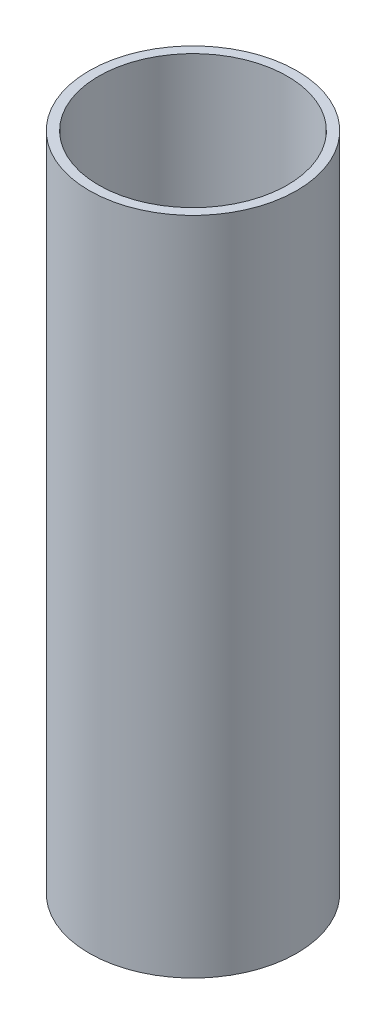
ISO-10303-21;
HEADER;
FILE_DESCRIPTION(('STEP AP214'),'2;1');
FILE_NAME('part.step','',(''),(''),'','','');
FILE_SCHEMA(('AUTOMOTIVE_DESIGN { 1 0 10303 214 1 1 1 1 }'));
ENDSEC;
DATA;
#1=APPLICATION_CONTEXT('core data for automotive mechanical design processes');
#2=APPLICATION_PROTOCOL_DEFINITION('international standard','automotive_design',2000,#1);
#3=PRODUCT_CONTEXT('',#1,'mechanical');
#4=PRODUCT('Part','Part','',(#3));
#5=PRODUCT_RELATED_PRODUCT_CATEGORY('part','',(#4));
#6=PRODUCT_DEFINITION_FORMATION('','',#4);
#7=PRODUCT_DEFINITION_CONTEXT('part definition',#1,'design');
#8=PRODUCT_DEFINITION('design','',#6,#7);
#9=PRODUCT_DEFINITION_SHAPE('','',#8);
#10=(LENGTH_UNIT() NAMED_UNIT(*) SI_UNIT(.MILLI.,.METRE.));
#11=(NAMED_UNIT(*) PLANE_ANGLE_UNIT() SI_UNIT($,.RADIAN.));
#12=(NAMED_UNIT(*) SI_UNIT($,.STERADIAN.) SOLID_ANGLE_UNIT());
#13=UNCERTAINTY_MEASURE_WITH_UNIT(LENGTH_MEASURE(1.E-05),#10,'distance_accuracy_value','');
#14=(GEOMETRIC_REPRESENTATION_CONTEXT(3) GLOBAL_UNCERTAINTY_ASSIGNED_CONTEXT((#13)) GLOBAL_UNIT_ASSIGNED_CONTEXT((#10,
#11,#12)) REPRESENTATION_CONTEXT('',''));
#15=CARTESIAN_POINT('',(0.,0.,0.));
#16=DIRECTION('',(0.,0.,1.));
#17=DIRECTION('',(1.,0.,0.));
#18=AXIS2_PLACEMENT_3D('',#15,#16,#17);
#19=CARTESIAN_POINT('',(0.,350.,0.));
#20=DIRECTION('',(0.,-1.,0.));
#21=DIRECTION('',(0.,0.,-1.));
#22=AXIS2_PLACEMENT_3D('',#19,#20,#21);
#23=CYLINDRICAL_SURFACE('',#22,55.);
#24=CARTESIAN_POINT('',(0.,350.,0.));
#25=DIRECTION('',(0.,1.,0.));
#26=DIRECTION('',(0.,0.,1.));
#27=AXIS2_PLACEMENT_3D('',#24,#25,#26);
#28=CIRCLE('',#27,55.);
#29=CARTESIAN_POINT('',(0.,350.,55.));
#30=VERTEX_POINT('',#29);
#31=EDGE_CURVE('E10',#30,#30,#28,.T.);
#32=ORIENTED_EDGE('',*,*,#31,.F.);
#33=EDGE_LOOP('',(#32));
#34=FACE_BOUND('',#33,.T.);
#35=CARTESIAN_POINT('',(0.,0.,0.));
#36=DIRECTION('',(0.,1.,0.));
#37=DIRECTION('',(0.,0.,1.));
#38=AXIS2_PLACEMENT_3D('',#35,#36,#37);
#39=CIRCLE('',#38,55.);
#40=CARTESIAN_POINT('',(0.,0.,55.));
#41=VERTEX_POINT('',#40);
#42=EDGE_CURVE('E35',#41,#41,#39,.T.);
#43=ORIENTED_EDGE('',*,*,#42,.T.);
#44=EDGE_LOOP('',(#43));
#45=FACE_BOUND('',#44,.T.);
#46=ADVANCED_FACE('F32',(#34,#45),#23,.T.);
#47=CARTESIAN_POINT('',(0.,350.,0.));
#48=DIRECTION('',(0.,1.,0.));
#49=DIRECTION('',(0.,0.,1.));
#50=AXIS2_PLACEMENT_3D('',#47,#48,#49);
#51=PLANE('',#50);
#52=CARTESIAN_POINT('',(0.,350.,0.));
#53=DIRECTION('',(0.,1.,0.));
#54=DIRECTION('',(0.,0.,1.));
#55=AXIS2_PLACEMENT_3D('',#52,#53,#54);
#56=CIRCLE('',#55,50.);
#57=CARTESIAN_POINT('',(0.,350.,50.));
#58=VERTEX_POINT('',#57);
#59=EDGE_CURVE('E46',#58,#58,#56,.T.);
#60=ORIENTED_EDGE('',*,*,#59,.F.);
#61=EDGE_LOOP('',(#60));
#62=FACE_BOUND('',#61,.T.);
#63=ORIENTED_EDGE('',*,*,#31,.T.);
#64=EDGE_LOOP('',(#63));
#65=FACE_BOUND('',#64,.T.);
#66=ADVANCED_FACE('F52',(#62,#65),#51,.T.);
#67=CARTESIAN_POINT('',(0.,0.,0.));
#68=DIRECTION('',(0.,1.,0.));
#69=DIRECTION('',(0.,0.,1.));
#70=AXIS2_PLACEMENT_3D('',#67,#68,#69);
#71=PLANE('',#70);
#72=CARTESIAN_POINT('',(0.,0.,0.));
#73=DIRECTION('',(0.,1.,0.));
#74=DIRECTION('',(0.,0.,1.));
#75=AXIS2_PLACEMENT_3D('',#72,#73,#74);
#76=CIRCLE('',#75,50.);
#77=CARTESIAN_POINT('',(0.,0.,50.));
#78=VERTEX_POINT('',#77);
#79=EDGE_CURVE('E42',#78,#78,#76,.F.);
#80=ORIENTED_EDGE('',*,*,#79,.F.);
#81=EDGE_LOOP('',(#80));
#82=FACE_BOUND('',#81,.T.);
#83=ORIENTED_EDGE('',*,*,#42,.F.);
#84=EDGE_LOOP('',(#83));
#85=FACE_BOUND('',#84,.T.);
#86=ADVANCED_FACE('F54',(#82,#85),#71,.F.);
#87=CARTESIAN_POINT('',(0.,-141.42135623731,0.));
#88=DIRECTION('',(0.,1.,0.));
#89=DIRECTION('',(0.,0.,1.));
#90=AXIS2_PLACEMENT_3D('',#87,#88,#89);
#91=CYLINDRICAL_SURFACE('',#90,50.);
#92=CARTESIAN_POINT('',(0.,0.,50.));
#93=CARTESIAN_POINT('',(0.,3.64583333333331,50.));
#94=CARTESIAN_POINT('',(0.,7.29166666666665,50.));
#95=CARTESIAN_POINT('',(0.,14.5833333333333,50.));
#96=CARTESIAN_POINT('',(0.,18.2291666666667,50.));
#97=CARTESIAN_POINT('',(0.,25.5208333333333,50.));
#98=CARTESIAN_POINT('',(0.,29.1666666666667,50.));
#99=CARTESIAN_POINT('',(0.,36.4583333333333,50.));
#100=CARTESIAN_POINT('',(0.,40.1041666666667,50.));
#101=CARTESIAN_POINT('',(0.,47.3958333333333,50.));
#102=CARTESIAN_POINT('',(0.,51.0416666666667,50.));
#103=CARTESIAN_POINT('',(0.,58.3333333333333,50.));
#104=CARTESIAN_POINT('',(0.,61.9791666666667,50.));
#105=CARTESIAN_POINT('',(0.,69.2708333333334,50.));
#106=CARTESIAN_POINT('',(0.,72.9166666666667,50.));
#107=CARTESIAN_POINT('',(0.,80.2083333333333,50.));
#108=CARTESIAN_POINT('',(0.,83.8541666666667,50.));
#109=CARTESIAN_POINT('',(0.,91.1458333333334,50.));
#110=CARTESIAN_POINT('',(0.,94.7916666666667,50.));
#111=CARTESIAN_POINT('',(0.,102.083333333333,50.));
#112=CARTESIAN_POINT('',(0.,105.729166666667,50.));
#113=CARTESIAN_POINT('',(0.,113.020833333333,50.));
#114=CARTESIAN_POINT('',(0.,116.666666666667,50.));
#115=CARTESIAN_POINT('',(0.,123.958333333333,50.));
#116=CARTESIAN_POINT('',(0.,127.604166666667,50.));
#117=CARTESIAN_POINT('',(0.,134.895833333333,50.));
#118=CARTESIAN_POINT('',(0.,138.541666666667,50.));
#119=CARTESIAN_POINT('',(0.,145.833333333333,50.));
#120=CARTESIAN_POINT('',(0.,149.479166666667,50.));
#121=CARTESIAN_POINT('',(0.,156.770833333333,50.));
#122=CARTESIAN_POINT('',(0.,160.416666666667,50.));
#123=CARTESIAN_POINT('',(0.,167.708333333333,50.));
#124=CARTESIAN_POINT('',(0.,171.354166666667,50.));
#125=CARTESIAN_POINT('',(0.,178.645833333333,50.));
#126=CARTESIAN_POINT('',(0.,182.291666666667,50.));
#127=CARTESIAN_POINT('',(0.,189.583333333333,50.));
#128=CARTESIAN_POINT('',(0.,193.229166666667,50.));
#129=CARTESIAN_POINT('',(0.,200.520833333333,50.));
#130=CARTESIAN_POINT('',(0.,204.166666666667,50.));
#131=CARTESIAN_POINT('',(0.,211.458333333333,50.));
#132=CARTESIAN_POINT('',(0.,215.104166666667,50.));
#133=CARTESIAN_POINT('',(0.,222.395833333333,50.));
#134=CARTESIAN_POINT('',(0.,226.041666666667,50.));
#135=CARTESIAN_POINT('',(0.,233.333333333333,50.));
#136=CARTESIAN_POINT('',(0.,236.979166666667,50.));
#137=CARTESIAN_POINT('',(0.,244.270833333333,50.));
#138=CARTESIAN_POINT('',(0.,247.916666666667,50.));
#139=CARTESIAN_POINT('',(0.,255.208333333333,50.));
#140=CARTESIAN_POINT('',(0.,258.854166666667,50.));
#141=CARTESIAN_POINT('',(0.,266.145833333333,50.));
#142=CARTESIAN_POINT('',(0.,269.791666666667,50.));
#143=CARTESIAN_POINT('',(0.,277.083333333333,50.));
#144=CARTESIAN_POINT('',(0.,280.729166666667,50.));
#145=CARTESIAN_POINT('',(0.,288.020833333333,50.));
#146=CARTESIAN_POINT('',(0.,291.666666666667,50.));
#147=CARTESIAN_POINT('',(0.,298.958333333333,50.));
#148=CARTESIAN_POINT('',(0.,302.604166666667,50.));
#149=CARTESIAN_POINT('',(0.,309.895833333333,50.));
#150=CARTESIAN_POINT('',(0.,313.541666666667,50.));
#151=CARTESIAN_POINT('',(0.,320.833333333333,50.));
#152=CARTESIAN_POINT('',(0.,324.479166666667,50.));
#153=CARTESIAN_POINT('',(0.,331.770833333333,50.));
#154=CARTESIAN_POINT('',(0.,335.416666666667,50.));
#155=CARTESIAN_POINT('',(0.,342.708333333333,50.));
#156=CARTESIAN_POINT('',(0.,346.354166666667,50.));
#157=CARTESIAN_POINT('',(0.,350.,50.));
#158=B_SPLINE_CURVE_WITH_KNOTS('',3,(#92,#93,#94,#95,#96,#97,#98,#99,#100,#101,#102,#103,#104,
#105,#106,#107,#108,#109,#110,#111,#112,#113,#114,#115,#116,#117,#118,#119,#120,#121,#122,#123,
#124,#125,#126,#127,#128,#129,#130,#131,#132,#133,#134,#135,#136,#137,#138,#139,#140,#141,#142,
#143,#144,#145,#146,#147,#148,#149,#150,#151,#152,#153,#154,#155,#156,#157),.UNSPECIFIED.,.F.,
.F.,(4,2,2,2,2,2,2,2,2,2,2,2,2,2,2,2,2,2,2,2,2,2,2,2,2,2,2,2,2,2,2,2,4),(0.,10.9375,21.875,
32.8125,43.75,54.6875,65.625,76.5625,87.5000000000001,98.4375000000001,109.375,120.3125,131.25,
142.1875,153.125,164.0625,175.,185.9375,196.875,207.8125,218.75,229.6875,240.625,251.5625,262.5,
273.4375,284.375,295.3125,306.25,317.1875,328.125,339.0625,350.),.UNSPECIFIED.);
#159=EDGE_CURVE('BSEAM50',#78,#58,#158,.T.);
#160=ORIENTED_EDGE('',*,*,#79,.T.);
#161=ORIENTED_EDGE('',*,*,#59,.T.);
#162=ORIENTED_EDGE('',*,*,#159,.T.);
#163=ORIENTED_EDGE('',*,*,#159,.F.);
#164=EDGE_LOOP('',(#160,#162,#161,#163));
#165=FACE_BOUND('',#164,.T.);
#166=ADVANCED_FACE('F50',(#165),#91,.F.);
#167=CLOSED_SHELL('',(#46,#66,#86,#166));
#168=MANIFOLD_SOLID_BREP('B2',#167);
#169=ADVANCED_BREP_SHAPE_REPRESENTATION('',(#18,#168),#14);
#170=SHAPE_DEFINITION_REPRESENTATION(#9,#169);
ENDSEC;
END-ISO-10303-21;
